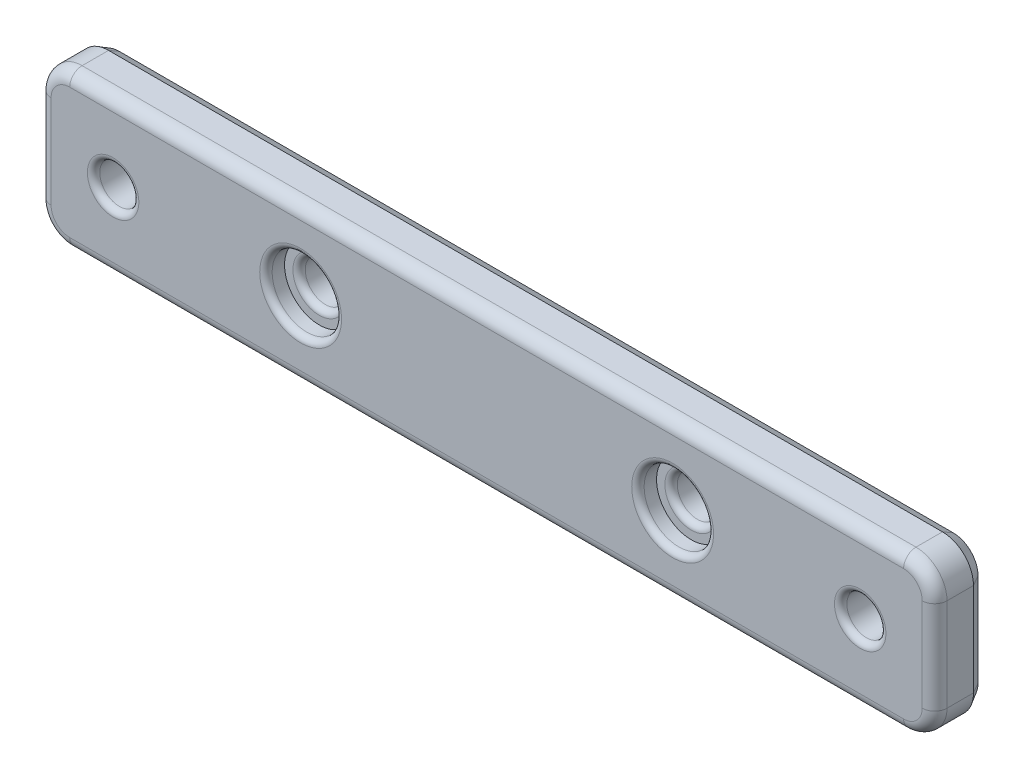
ISO-10303-21;
HEADER;
FILE_DESCRIPTION(('STEP AP214'),'2;1');
FILE_NAME('part.step','',(''),(''),'','','');
FILE_SCHEMA(('AUTOMOTIVE_DESIGN { 1 0 10303 214 1 1 1 1 }'));
ENDSEC;
DATA;
#1=APPLICATION_CONTEXT('core data for automotive mechanical design processes');
#2=APPLICATION_PROTOCOL_DEFINITION('international standard','automotive_design',2000,#1);
#3=PRODUCT_CONTEXT('',#1,'mechanical');
#4=PRODUCT('Part','Part','',(#3));
#5=PRODUCT_RELATED_PRODUCT_CATEGORY('part','',(#4));
#6=PRODUCT_DEFINITION_FORMATION('','',#4);
#7=PRODUCT_DEFINITION_CONTEXT('part definition',#1,'design');
#8=PRODUCT_DEFINITION('design','',#6,#7);
#9=PRODUCT_DEFINITION_SHAPE('','',#8);
#10=(LENGTH_UNIT() NAMED_UNIT(*) SI_UNIT(.MILLI.,.METRE.));
#11=(NAMED_UNIT(*) PLANE_ANGLE_UNIT() SI_UNIT($,.RADIAN.));
#12=(NAMED_UNIT(*) SI_UNIT($,.STERADIAN.) SOLID_ANGLE_UNIT());
#13=UNCERTAINTY_MEASURE_WITH_UNIT(LENGTH_MEASURE(1.E-05),#10,'distance_accuracy_value','');
#14=(GEOMETRIC_REPRESENTATION_CONTEXT(3) GLOBAL_UNCERTAINTY_ASSIGNED_CONTEXT((#13)) GLOBAL_UNIT_ASSIGNED_CONTEXT((#10,
#11,#12)) REPRESENTATION_CONTEXT('',''));
#15=CARTESIAN_POINT('',(0.,0.,0.));
#16=DIRECTION('',(0.,0.,1.));
#17=DIRECTION('',(1.,0.,0.));
#18=AXIS2_PLACEMENT_3D('',#15,#16,#17);
#19=CARTESIAN_POINT('',(-30.,0.,0.));
#20=DIRECTION('',(0.,0.,1.));
#21=DIRECTION('',(1.,0.,0.));
#22=AXIS2_PLACEMENT_3D('',#19,#20,#21);
#23=CYLINDRICAL_SURFACE('',#22,3.25000000000001);
#24=CARTESIAN_POINT('',(-30.,0.,1.00000000000003));
#25=DIRECTION('',(0.,0.,-1.));
#26=DIRECTION('',(-1.,0.,0.));
#27=AXIS2_PLACEMENT_3D('',#24,#25,#26);
#28=CIRCLE('',#27,3.25000000000001);
#29=CARTESIAN_POINT('',(-33.25,0.,1.00000000000003));
#30=VERTEX_POINT('',#29);
#31=EDGE_CURVE('E53',#30,#30,#28,.T.);
#32=ORIENTED_EDGE('',*,*,#31,.T.);
#33=EDGE_LOOP('',(#32));
#34=FACE_BOUND('',#33,.T.);
#35=CARTESIAN_POINT('',(-30.,0.,4.));
#36=DIRECTION('',(0.,0.,1.));
#37=DIRECTION('',(1.,0.,0.));
#38=AXIS2_PLACEMENT_3D('',#35,#36,#37);
#39=CIRCLE('',#38,3.25000000000001);
#40=CARTESIAN_POINT('',(-26.75,0.,4.));
#41=VERTEX_POINT('',#40);
#42=EDGE_CURVE('E260',#41,#41,#39,.T.);
#43=ORIENTED_EDGE('',*,*,#42,.T.);
#44=EDGE_LOOP('',(#43));
#45=FACE_BOUND('',#44,.T.);
#46=ADVANCED_FACE('F43',(#34,#45),#23,.F.);
#47=CARTESIAN_POINT('',(30.,0.,0.));
#48=DIRECTION('',(0.,0.,1.));
#49=DIRECTION('',(1.,0.,0.));
#50=AXIS2_PLACEMENT_3D('',#47,#48,#49);
#51=CYLINDRICAL_SURFACE('',#50,3.25);
#52=CARTESIAN_POINT('',(30.,0.,1.00000000000001));
#53=DIRECTION('',(0.,0.,-1.));
#54=DIRECTION('',(-1.,0.,0.));
#55=AXIS2_PLACEMENT_3D('',#52,#53,#54);
#56=CIRCLE('',#55,3.25);
#57=CARTESIAN_POINT('',(26.75,0.,1.00000000000001));
#58=VERTEX_POINT('',#57);
#59=EDGE_CURVE('E393',#58,#58,#56,.T.);
#60=ORIENTED_EDGE('',*,*,#59,.T.);
#61=EDGE_LOOP('',(#60));
#62=FACE_BOUND('',#61,.T.);
#63=CARTESIAN_POINT('',(30.,0.,4.));
#64=DIRECTION('',(0.,0.,1.));
#65=DIRECTION('',(1.,0.,0.));
#66=AXIS2_PLACEMENT_3D('',#63,#64,#65);
#67=CIRCLE('',#66,3.25);
#68=CARTESIAN_POINT('',(33.25,0.,4.));
#69=VERTEX_POINT('',#68);
#70=EDGE_CURVE('E252',#69,#69,#67,.T.);
#71=ORIENTED_EDGE('',*,*,#70,.T.);
#72=EDGE_LOOP('',(#71));
#73=FACE_BOUND('',#72,.T.);
#74=ADVANCED_FACE('F545',(#62,#73),#51,.F.);
#75=CARTESIAN_POINT('',(72.25,-12.5,8.));
#76=DIRECTION('',(-1.,0.,0.));
#77=DIRECTION('',(0.,0.,1.));
#78=AXIS2_PLACEMENT_3D('',#75,#76,#77);
#79=PLANE('',#78);
#80=DIRECTION('',(0.,0.,-1.));
#81=VECTOR('',#80,1.);
#82=CARTESIAN_POINT('',(72.25,-7.5,8.));
#83=LINE('',#82,#81);
#84=CARTESIAN_POINT('',(72.25,-7.5,6.));
#85=VERTEX_POINT('',#84);
#86=CARTESIAN_POINT('',(72.25,-7.5,1.73205080756889));
#87=VERTEX_POINT('',#86);
#88=EDGE_CURVE('E184',#85,#87,#83,.T.);
#89=ORIENTED_EDGE('',*,*,#88,.T.);
#90=DIRECTION('',(0.,1.,0.));
#91=VECTOR('',#90,1.);
#92=CARTESIAN_POINT('',(72.25,7.5,1.73205080756889));
#93=LINE('',#92,#91);
#94=CARTESIAN_POINT('',(72.25,7.5,1.73205080756889));
#95=VERTEX_POINT('',#94);
#96=EDGE_CURVE('E334',#87,#95,#93,.T.);
#97=ORIENTED_EDGE('',*,*,#96,.T.);
#98=DIRECTION('',(0.,0.,-1.));
#99=VECTOR('',#98,1.);
#100=CARTESIAN_POINT('',(72.25,7.5,8.));
#101=LINE('',#100,#99);
#102=CARTESIAN_POINT('',(72.25,7.5,6.));
#103=VERTEX_POINT('',#102);
#104=EDGE_CURVE('E442',#95,#103,#101,.F.);
#105=ORIENTED_EDGE('',*,*,#104,.T.);
#106=DIRECTION('',(0.,1.,0.));
#107=VECTOR('',#106,1.);
#108=CARTESIAN_POINT('',(72.25,-12.5,6.));
#109=LINE('',#108,#107);
#110=EDGE_CURVE('E194',#103,#85,#109,.F.);
#111=ORIENTED_EDGE('',*,*,#110,.T.);
#112=EDGE_LOOP('',(#89,#97,#105,#111));
#113=FACE_BOUND('',#112,.T.);
#114=ADVANCED_FACE('F550',(#113),#79,.F.);
#115=CARTESIAN_POINT('',(-72.25,12.5,8.));
#116=DIRECTION('',(0.,-1.,0.));
#117=DIRECTION('',(0.,0.,-1.));
#118=AXIS2_PLACEMENT_3D('',#115,#116,#117);
#119=PLANE('',#118);
#120=DIRECTION('',(0.,0.,-1.));
#121=VECTOR('',#120,1.);
#122=CARTESIAN_POINT('',(67.25,12.5,8.));
#123=LINE('',#122,#121);
#124=CARTESIAN_POINT('',(67.25,12.5,6.));
#125=VERTEX_POINT('',#124);
#126=CARTESIAN_POINT('',(67.25,12.5,1.73205080756889));
#127=VERTEX_POINT('',#126);
#128=EDGE_CURVE('E438',#125,#127,#123,.T.);
#129=ORIENTED_EDGE('',*,*,#128,.T.);
#130=DIRECTION('',(-1.,0.,0.));
#131=VECTOR('',#130,1.);
#132=CARTESIAN_POINT('',(-67.25,12.5,1.73205080756889));
#133=LINE('',#132,#131);
#134=CARTESIAN_POINT('',(-67.25,12.5,1.73205080756889));
#135=VERTEX_POINT('',#134);
#136=EDGE_CURVE('E296',#127,#135,#133,.T.);
#137=ORIENTED_EDGE('',*,*,#136,.T.);
#138=DIRECTION('',(0.,0.,-1.));
#139=VECTOR('',#138,1.);
#140=CARTESIAN_POINT('',(-67.25,12.5,8.));
#141=LINE('',#140,#139);
#142=CARTESIAN_POINT('',(-67.25,12.5,6.));
#143=VERTEX_POINT('',#142);
#144=EDGE_CURVE('E436',#135,#143,#141,.F.);
#145=ORIENTED_EDGE('',*,*,#144,.T.);
#146=DIRECTION('',(-1.,0.,0.));
#147=VECTOR('',#146,1.);
#148=CARTESIAN_POINT('',(-72.25,12.5,6.));
#149=LINE('',#148,#147);
#150=EDGE_CURVE('E220',#143,#125,#149,.F.);
#151=ORIENTED_EDGE('',*,*,#150,.T.);
#152=EDGE_LOOP('',(#129,#137,#145,#151));
#153=FACE_BOUND('',#152,.T.);
#154=ADVANCED_FACE('F435',(#153),#119,.F.);
#155=CARTESIAN_POINT('',(-72.25,-12.5,8.));
#156=DIRECTION('',(1.,0.,0.));
#157=DIRECTION('',(0.,0.,-1.));
#158=AXIS2_PLACEMENT_3D('',#155,#156,#157);
#159=PLANE('',#158);
#160=DIRECTION('',(0.,0.,-1.));
#161=VECTOR('',#160,1.);
#162=CARTESIAN_POINT('',(-72.25,7.5,8.));
#163=LINE('',#162,#161);
#164=CARTESIAN_POINT('',(-72.25,7.5,6.));
#165=VERTEX_POINT('',#164);
#166=CARTESIAN_POINT('',(-72.25,7.5,1.73205080756889));
#167=VERTEX_POINT('',#166);
#168=EDGE_CURVE('E507',#165,#167,#163,.T.);
#169=ORIENTED_EDGE('',*,*,#168,.T.);
#170=DIRECTION('',(0.,-1.,0.));
#171=VECTOR('',#170,1.);
#172=CARTESIAN_POINT('',(-72.25,-7.5,1.73205080756889));
#173=LINE('',#172,#171);
#174=CARTESIAN_POINT('',(-72.25,-7.5,1.73205080756889));
#175=VERTEX_POINT('',#174);
#176=EDGE_CURVE('E331',#167,#175,#173,.T.);
#177=ORIENTED_EDGE('',*,*,#176,.T.);
#178=DIRECTION('',(0.,0.,-1.));
#179=VECTOR('',#178,1.);
#180=CARTESIAN_POINT('',(-72.25,-7.5,8.));
#181=LINE('',#180,#179);
#182=CARTESIAN_POINT('',(-72.25,-7.5,6.));
#183=VERTEX_POINT('',#182);
#184=EDGE_CURVE('E447',#175,#183,#181,.F.);
#185=ORIENTED_EDGE('',*,*,#184,.T.);
#186=DIRECTION('',(0.,-1.,0.));
#187=VECTOR('',#186,1.);
#188=CARTESIAN_POINT('',(-72.25,-12.5,6.));
#189=LINE('',#188,#187);
#190=EDGE_CURVE('E213',#183,#165,#189,.F.);
#191=ORIENTED_EDGE('',*,*,#190,.T.);
#192=EDGE_LOOP('',(#169,#177,#185,#191));
#193=FACE_BOUND('',#192,.T.);
#194=ADVANCED_FACE('F506',(#193),#159,.F.);
#195=CARTESIAN_POINT('',(-72.25,-12.5,8.));
#196=DIRECTION('',(0.,1.,0.));
#197=DIRECTION('',(0.,0.,1.));
#198=AXIS2_PLACEMENT_3D('',#195,#196,#197);
#199=PLANE('',#198);
#200=DIRECTION('',(0.,0.,-1.));
#201=VECTOR('',#200,1.);
#202=CARTESIAN_POINT('',(-67.25,-12.5,8.));
#203=LINE('',#202,#201);
#204=CARTESIAN_POINT('',(-67.25,-12.5,6.));
#205=VERTEX_POINT('',#204);
#206=CARTESIAN_POINT('',(-67.25,-12.5,1.73205080756889));
#207=VERTEX_POINT('',#206);
#208=EDGE_CURVE('E513',#205,#207,#203,.T.);
#209=ORIENTED_EDGE('',*,*,#208,.T.);
#210=DIRECTION('',(1.,0.,0.));
#211=VECTOR('',#210,1.);
#212=CARTESIAN_POINT('',(67.25,-12.5,1.73205080756889));
#213=LINE('',#212,#211);
#214=CARTESIAN_POINT('',(67.25,-12.5,1.73205080756889));
#215=VERTEX_POINT('',#214);
#216=EDGE_CURVE('E60',#207,#215,#213,.T.);
#217=ORIENTED_EDGE('',*,*,#216,.T.);
#218=DIRECTION('',(0.,0.,-1.));
#219=VECTOR('',#218,1.);
#220=CARTESIAN_POINT('',(67.25,-12.5,8.));
#221=LINE('',#220,#219);
#222=CARTESIAN_POINT('',(67.25,-12.5,6.));
#223=VERTEX_POINT('',#222);
#224=EDGE_CURVE('E518',#215,#223,#221,.F.);
#225=ORIENTED_EDGE('',*,*,#224,.T.);
#226=DIRECTION('',(1.,0.,0.));
#227=VECTOR('',#226,1.);
#228=CARTESIAN_POINT('',(-72.25,-12.5,6.));
#229=LINE('',#228,#227);
#230=EDGE_CURVE('E206',#223,#205,#229,.F.);
#231=ORIENTED_EDGE('',*,*,#230,.T.);
#232=EDGE_LOOP('',(#209,#217,#225,#231));
#233=FACE_BOUND('',#232,.T.);
#234=ADVANCED_FACE('F556',(#233),#199,.F.);
#235=CARTESIAN_POINT('',(0.,0.,8.));
#236=DIRECTION('',(0.,0.,-1.));
#237=DIRECTION('',(-1.,0.,0.));
#238=AXIS2_PLACEMENT_3D('',#235,#236,#237);
#239=PLANE('',#238);
#240=CARTESIAN_POINT('',(60.25,0.,8.));
#241=DIRECTION('',(0.,0.,-1.));
#242=DIRECTION('',(-1.,0.,0.));
#243=AXIS2_PLACEMENT_3D('',#240,#241,#242);
#244=CIRCLE('',#243,4.15);
#245=CARTESIAN_POINT('',(56.1,0.,8.));
#246=VERTEX_POINT('',#245);
#247=EDGE_CURVE('E280',#246,#246,#244,.T.);
#248=ORIENTED_EDGE('',*,*,#247,.T.);
#249=EDGE_LOOP('',(#248));
#250=FACE_BOUND('',#249,.T.);
#251=CARTESIAN_POINT('',(-60.25,0.,8.));
#252=DIRECTION('',(0.,0.,-1.));
#253=DIRECTION('',(-1.,0.,0.));
#254=AXIS2_PLACEMENT_3D('',#251,#252,#253);
#255=CIRCLE('',#254,4.15);
#256=CARTESIAN_POINT('',(-64.4,0.,8.));
#257=VERTEX_POINT('',#256);
#258=EDGE_CURVE('E276',#257,#257,#255,.T.);
#259=ORIENTED_EDGE('',*,*,#258,.T.);
#260=EDGE_LOOP('',(#259));
#261=FACE_BOUND('',#260,.T.);
#262=CARTESIAN_POINT('',(30.,0.,8.));
#263=DIRECTION('',(0.,0.,-1.));
#264=DIRECTION('',(-1.,0.,0.));
#265=AXIS2_PLACEMENT_3D('',#262,#263,#264);
#266=CIRCLE('',#265,6.6);
#267=CARTESIAN_POINT('',(23.4,0.,8.));
#268=VERTEX_POINT('',#267);
#269=EDGE_CURVE('E272',#268,#268,#266,.T.);
#270=ORIENTED_EDGE('',*,*,#269,.T.);
#271=EDGE_LOOP('',(#270));
#272=FACE_BOUND('',#271,.T.);
#273=CARTESIAN_POINT('',(-30.,0.,8.));
#274=DIRECTION('',(0.,0.,-1.));
#275=DIRECTION('',(-1.,0.,0.));
#276=AXIS2_PLACEMENT_3D('',#273,#274,#275);
#277=CIRCLE('',#276,6.6);
#278=CARTESIAN_POINT('',(-36.6,0.,8.));
#279=VERTEX_POINT('',#278);
#280=EDGE_CURVE('E268',#279,#279,#277,.T.);
#281=ORIENTED_EDGE('',*,*,#280,.T.);
#282=EDGE_LOOP('',(#281));
#283=FACE_BOUND('',#282,.T.);
#284=DIRECTION('',(0.,1.,0.));
#285=VECTOR('',#284,1.);
#286=CARTESIAN_POINT('',(70.25,0.,8.));
#287=LINE('',#286,#285);
#288=CARTESIAN_POINT('',(70.25,-7.5,8.));
#289=VERTEX_POINT('',#288);
#290=CARTESIAN_POINT('',(70.25,7.5,8.));
#291=VERTEX_POINT('',#290);
#292=EDGE_CURVE('E188',#289,#291,#287,.T.);
#293=ORIENTED_EDGE('',*,*,#292,.T.);
#294=CARTESIAN_POINT('',(67.25,7.5,8.));
#295=DIRECTION('',(0.,0.,-1.));
#296=DIRECTION('',(-1.,0.,0.));
#297=AXIS2_PLACEMENT_3D('',#294,#295,#296);
#298=CIRCLE('',#297,3.);
#299=CARTESIAN_POINT('',(67.25,10.5,8.));
#300=VERTEX_POINT('',#299);
#301=EDGE_CURVE('E166',#291,#300,#298,.F.);
#302=ORIENTED_EDGE('',*,*,#301,.T.);
#303=DIRECTION('',(-1.,0.,0.));
#304=VECTOR('',#303,1.);
#305=CARTESIAN_POINT('',(0.,10.5,8.));
#306=LINE('',#305,#304);
#307=CARTESIAN_POINT('',(-67.25,10.5,8.));
#308=VERTEX_POINT('',#307);
#309=EDGE_CURVE('E176',#300,#308,#306,.T.);
#310=ORIENTED_EDGE('',*,*,#309,.T.);
#311=CARTESIAN_POINT('',(-67.25,7.5,8.));
#312=DIRECTION('',(0.,0.,-1.));
#313=DIRECTION('',(-1.,0.,0.));
#314=AXIS2_PLACEMENT_3D('',#311,#312,#313);
#315=CIRCLE('',#314,3.);
#316=CARTESIAN_POINT('',(-70.25,7.5,8.));
#317=VERTEX_POINT('',#316);
#318=EDGE_CURVE('E183',#308,#317,#315,.F.);
#319=ORIENTED_EDGE('',*,*,#318,.T.);
#320=DIRECTION('',(0.,-1.,0.));
#321=VECTOR('',#320,1.);
#322=CARTESIAN_POINT('',(-70.25,0.,8.));
#323=LINE('',#322,#321);
#324=CARTESIAN_POINT('',(-70.25,-7.5,8.));
#325=VERTEX_POINT('',#324);
#326=EDGE_CURVE('E456',#317,#325,#323,.T.);
#327=ORIENTED_EDGE('',*,*,#326,.T.);
#328=CARTESIAN_POINT('',(-67.25,-7.5,8.));
#329=DIRECTION('',(0.,0.,-1.));
#330=DIRECTION('',(-1.,0.,0.));
#331=AXIS2_PLACEMENT_3D('',#328,#329,#330);
#332=CIRCLE('',#331,3.);
#333=CARTESIAN_POINT('',(-67.25,-10.5,8.));
#334=VERTEX_POINT('',#333);
#335=EDGE_CURVE('E459',#325,#334,#332,.F.);
#336=ORIENTED_EDGE('',*,*,#335,.T.);
#337=DIRECTION('',(1.,0.,0.));
#338=VECTOR('',#337,1.);
#339=CARTESIAN_POINT('',(0.,-10.5,8.));
#340=LINE('',#339,#338);
#341=CARTESIAN_POINT('',(67.25,-10.5,8.));
#342=VERTEX_POINT('',#341);
#343=EDGE_CURVE('E462',#334,#342,#340,.T.);
#344=ORIENTED_EDGE('',*,*,#343,.T.);
#345=CARTESIAN_POINT('',(67.25,-7.5,8.));
#346=DIRECTION('',(0.,0.,-1.));
#347=DIRECTION('',(-1.,0.,0.));
#348=AXIS2_PLACEMENT_3D('',#345,#346,#347);
#349=CIRCLE('',#348,3.);
#350=EDGE_CURVE('E196',#342,#289,#349,.F.);
#351=ORIENTED_EDGE('',*,*,#350,.T.);
#352=EDGE_LOOP('',(#293,#302,#310,#319,#327,#336,#344,#351));
#353=FACE_BOUND('',#352,.T.);
#354=ADVANCED_FACE('F186',(#250,#261,#272,#283,#353),#239,.F.);
#355=CARTESIAN_POINT('',(0.,0.,0.));
#356=DIRECTION('',(0.,0.,-1.));
#357=DIRECTION('',(-1.,0.,0.));
#358=AXIS2_PLACEMENT_3D('',#355,#356,#357);
#359=PLANE('',#358);
#360=CARTESIAN_POINT('',(60.25,0.,0.));
#361=DIRECTION('',(0.,0.,-1.));
#362=DIRECTION('',(-1.,0.,0.));
#363=AXIS2_PLACEMENT_3D('',#360,#361,#362);
#364=CIRCLE('',#363,3.72735026918961);
#365=CARTESIAN_POINT('',(56.5226497308104,0.,0.));
#366=VERTEX_POINT('',#365);
#367=EDGE_CURVE('E385',#366,#366,#364,.F.);
#368=ORIENTED_EDGE('',*,*,#367,.T.);
#369=EDGE_LOOP('',(#368));
#370=FACE_BOUND('',#369,.T.);
#371=CARTESIAN_POINT('',(30.,0.,0.));
#372=DIRECTION('',(0.,0.,-1.));
#373=DIRECTION('',(-1.,0.,0.));
#374=AXIS2_PLACEMENT_3D('',#371,#372,#373);
#375=CIRCLE('',#374,3.82735026918964);
#376=CARTESIAN_POINT('',(26.1726497308104,0.,0.));
#377=VERTEX_POINT('',#376);
#378=EDGE_CURVE('E381',#377,#377,#375,.F.);
#379=ORIENTED_EDGE('',*,*,#378,.T.);
#380=EDGE_LOOP('',(#379));
#381=FACE_BOUND('',#380,.T.);
#382=CARTESIAN_POINT('',(-30.,0.,0.));
#383=DIRECTION('',(0.,0.,-1.));
#384=DIRECTION('',(-1.,0.,0.));
#385=AXIS2_PLACEMENT_3D('',#382,#383,#384);
#386=CIRCLE('',#385,3.82735026918965);
#387=CARTESIAN_POINT('',(-33.8273502691896,0.,0.));
#388=VERTEX_POINT('',#387);
#389=EDGE_CURVE('E377',#388,#388,#386,.F.);
#390=ORIENTED_EDGE('',*,*,#389,.T.);
#391=EDGE_LOOP('',(#390));
#392=FACE_BOUND('',#391,.T.);
#393=CARTESIAN_POINT('',(-60.25,0.,0.));
#394=DIRECTION('',(0.,0.,-1.));
#395=DIRECTION('',(-1.,0.,0.));
#396=AXIS2_PLACEMENT_3D('',#393,#394,#395);
#397=CIRCLE('',#396,3.72735026918961);
#398=CARTESIAN_POINT('',(-63.9773502691896,0.,0.));
#399=VERTEX_POINT('',#398);
#400=EDGE_CURVE('E344',#399,#399,#397,.F.);
#401=ORIENTED_EDGE('',*,*,#400,.T.);
#402=EDGE_LOOP('',(#401));
#403=FACE_BOUND('',#402,.T.);
#404=CARTESIAN_POINT('',(-67.25,7.5,0.));
#405=DIRECTION('',(0.,0.,-1.));
#406=DIRECTION('',(-1.,0.,0.));
#407=AXIS2_PLACEMENT_3D('',#404,#405,#406);
#408=CIRCLE('',#407,3.99999999999999);
#409=CARTESIAN_POINT('',(-71.25,7.5,0.));
#410=VERTEX_POINT('',#409);
#411=CARTESIAN_POINT('',(-67.25,11.5,0.));
#412=VERTEX_POINT('',#411);
#413=EDGE_CURVE('E318',#410,#412,#408,.T.);
#414=ORIENTED_EDGE('',*,*,#413,.T.);
#415=DIRECTION('',(1.,0.,0.));
#416=VECTOR('',#415,1.);
#417=CARTESIAN_POINT('',(67.25,11.5,0.));
#418=LINE('',#417,#416);
#419=CARTESIAN_POINT('',(67.25,11.5,0.));
#420=VERTEX_POINT('',#419);
#421=EDGE_CURVE('E321',#412,#420,#418,.T.);
#422=ORIENTED_EDGE('',*,*,#421,.T.);
#423=CARTESIAN_POINT('',(67.25,7.5,0.));
#424=DIRECTION('',(0.,0.,-1.));
#425=DIRECTION('',(-1.,0.,0.));
#426=AXIS2_PLACEMENT_3D('',#423,#424,#425);
#427=CIRCLE('',#426,3.99999999999999);
#428=CARTESIAN_POINT('',(71.25,7.5,0.));
#429=VERTEX_POINT('',#428);
#430=EDGE_CURVE('E315',#420,#429,#427,.T.);
#431=ORIENTED_EDGE('',*,*,#430,.T.);
#432=DIRECTION('',(0.,-1.,0.));
#433=VECTOR('',#432,1.);
#434=CARTESIAN_POINT('',(71.25,-7.5,0.));
#435=LINE('',#434,#433);
#436=CARTESIAN_POINT('',(71.25,-7.5,0.));
#437=VERTEX_POINT('',#436);
#438=EDGE_CURVE('E309',#429,#437,#435,.T.);
#439=ORIENTED_EDGE('',*,*,#438,.T.);
#440=CARTESIAN_POINT('',(67.25,-7.5,0.));
#441=DIRECTION('',(0.,0.,-1.));
#442=DIRECTION('',(-1.,0.,0.));
#443=AXIS2_PLACEMENT_3D('',#440,#441,#442);
#444=CIRCLE('',#443,3.99999999999999);
#445=CARTESIAN_POINT('',(67.25,-11.5,0.));
#446=VERTEX_POINT('',#445);
#447=EDGE_CURVE('E303',#437,#446,#444,.T.);
#448=ORIENTED_EDGE('',*,*,#447,.T.);
#449=DIRECTION('',(-1.,0.,0.));
#450=VECTOR('',#449,1.);
#451=CARTESIAN_POINT('',(-67.25,-11.5,0.));
#452=LINE('',#451,#450);
#453=CARTESIAN_POINT('',(-67.25,-11.5,0.));
#454=VERTEX_POINT('',#453);
#455=EDGE_CURVE('E300',#446,#454,#452,.T.);
#456=ORIENTED_EDGE('',*,*,#455,.T.);
#457=CARTESIAN_POINT('',(-67.25,-7.5,0.));
#458=DIRECTION('',(0.,0.,-1.));
#459=DIRECTION('',(-1.,0.,0.));
#460=AXIS2_PLACEMENT_3D('',#457,#458,#459);
#461=CIRCLE('',#460,3.99999999999999);
#462=CARTESIAN_POINT('',(-71.25,-7.5,0.));
#463=VERTEX_POINT('',#462);
#464=EDGE_CURVE('E306',#454,#463,#461,.T.);
#465=ORIENTED_EDGE('',*,*,#464,.T.);
#466=DIRECTION('',(0.,1.,0.));
#467=VECTOR('',#466,1.);
#468=CARTESIAN_POINT('',(-71.25,7.5,0.));
#469=LINE('',#468,#467);
#470=EDGE_CURVE('E312',#463,#410,#469,.T.);
#471=ORIENTED_EDGE('',*,*,#470,.T.);
#472=EDGE_LOOP('',(#414,#422,#431,#439,#448,#456,#465,#471));
#473=FACE_BOUND('',#472,.T.);
#474=ADVANCED_FACE('F408',(#370,#381,#392,#403,#473),#359,.T.);
#475=CARTESIAN_POINT('',(60.25,0.,0.));
#476=DIRECTION('',(0.,0.,1.));
#477=DIRECTION('',(1.,0.,0.));
#478=AXIS2_PLACEMENT_3D('',#475,#476,#477);
#479=CYLINDRICAL_SURFACE('',#478,3.15);
#480=CARTESIAN_POINT('',(60.25,0.,0.999999999999975));
#481=DIRECTION('',(0.,0.,-1.));
#482=DIRECTION('',(-1.,0.,0.));
#483=AXIS2_PLACEMENT_3D('',#480,#481,#482);
#484=CIRCLE('',#483,3.15);
#485=CARTESIAN_POINT('',(57.1,0.,0.999999999999975));
#486=VERTEX_POINT('',#485);
#487=EDGE_CURVE('E389',#486,#486,#484,.T.);
#488=ORIENTED_EDGE('',*,*,#487,.T.);
#489=EDGE_LOOP('',(#488));
#490=FACE_BOUND('',#489,.T.);
#491=CARTESIAN_POINT('',(60.25,0.,7.));
#492=DIRECTION('',(0.,0.,-1.));
#493=DIRECTION('',(-1.,0.,0.));
#494=AXIS2_PLACEMENT_3D('',#491,#492,#493);
#495=CIRCLE('',#494,3.15);
#496=CARTESIAN_POINT('',(57.1,0.,7.));
#497=VERTEX_POINT('',#496);
#498=EDGE_CURVE('E264',#497,#497,#495,.F.);
#499=ORIENTED_EDGE('',*,*,#498,.T.);
#500=EDGE_LOOP('',(#499));
#501=FACE_BOUND('',#500,.T.);
#502=ADVANCED_FACE('F411',(#490,#501),#479,.F.);
#503=CARTESIAN_POINT('',(-60.25,0.,0.));
#504=DIRECTION('',(0.,0.,1.));
#505=DIRECTION('',(1.,0.,0.));
#506=AXIS2_PLACEMENT_3D('',#503,#504,#505);
#507=CYLINDRICAL_SURFACE('',#506,3.15);
#508=CARTESIAN_POINT('',(-60.25,0.,0.999999999999951));
#509=DIRECTION('',(0.,0.,-1.));
#510=DIRECTION('',(-1.,0.,0.));
#511=AXIS2_PLACEMENT_3D('',#508,#509,#510);
#512=CIRCLE('',#511,3.15);
#513=CARTESIAN_POINT('',(-63.4,0.,0.999999999999951));
#514=VERTEX_POINT('',#513);
#515=EDGE_CURVE('E11',#514,#514,#512,.T.);
#516=ORIENTED_EDGE('',*,*,#515,.T.);
#517=EDGE_LOOP('',(#516));
#518=FACE_BOUND('',#517,.T.);
#519=CARTESIAN_POINT('',(-60.25,0.,7.));
#520=DIRECTION('',(0.,0.,-1.));
#521=DIRECTION('',(-1.,0.,0.));
#522=AXIS2_PLACEMENT_3D('',#519,#520,#521);
#523=CIRCLE('',#522,3.15);
#524=CARTESIAN_POINT('',(-63.4,0.,7.));
#525=VERTEX_POINT('',#524);
#526=EDGE_CURVE('E284',#525,#525,#523,.F.);
#527=ORIENTED_EDGE('',*,*,#526,.T.);
#528=EDGE_LOOP('',(#527));
#529=FACE_BOUND('',#528,.T.);
#530=ADVANCED_FACE('F694',(#518,#529),#507,.F.);
#531=CARTESIAN_POINT('',(30.,0.,5.));
#532=DIRECTION('',(0.,0.,1.));
#533=DIRECTION('',(1.,0.,0.));
#534=AXIS2_PLACEMENT_3D('',#531,#532,#533);
#535=PLANE('',#534);
#536=CARTESIAN_POINT('',(30.,0.,5.));
#537=DIRECTION('',(0.,0.,1.));
#538=DIRECTION('',(1.,0.,0.));
#539=AXIS2_PLACEMENT_3D('',#536,#537,#538);
#540=CIRCLE('',#539,4.25);
#541=CARTESIAN_POINT('',(34.25,0.,5.));
#542=VERTEX_POINT('',#541);
#543=EDGE_CURVE('E222',#542,#542,#540,.F.);
#544=ORIENTED_EDGE('',*,*,#543,.T.);
#545=EDGE_LOOP('',(#544));
#546=FACE_BOUND('',#545,.T.);
#547=CARTESIAN_POINT('',(30.,0.,5.));
#548=DIRECTION('',(0.,0.,1.));
#549=DIRECTION('',(1.,0.,0.));
#550=AXIS2_PLACEMENT_3D('',#547,#548,#549);
#551=CIRCLE('',#550,5.6);
#552=CARTESIAN_POINT('',(35.6,0.,5.));
#553=VERTEX_POINT('',#552);
#554=EDGE_CURVE('E248',#553,#553,#551,.T.);
#555=ORIENTED_EDGE('',*,*,#554,.T.);
#556=EDGE_LOOP('',(#555));
#557=FACE_BOUND('',#556,.T.);
#558=ADVANCED_FACE('F691',(#546,#557),#535,.T.);
#559=CARTESIAN_POINT('',(30.,0.,5.));
#560=DIRECTION('',(0.,0.,1.));
#561=DIRECTION('',(1.,0.,0.));
#562=AXIS2_PLACEMENT_3D('',#559,#560,#561);
#563=CYLINDRICAL_SURFACE('',#562,5.6);
#564=CARTESIAN_POINT('',(30.,0.,7.));
#565=DIRECTION('',(0.,0.,-1.));
#566=DIRECTION('',(-1.,0.,0.));
#567=AXIS2_PLACEMENT_3D('',#564,#565,#566);
#568=CIRCLE('',#567,5.6);
#569=CARTESIAN_POINT('',(24.4,0.,7.));
#570=VERTEX_POINT('',#569);
#571=EDGE_CURVE('E288',#570,#570,#568,.F.);
#572=ORIENTED_EDGE('',*,*,#571,.T.);
#573=EDGE_LOOP('',(#572));
#574=FACE_BOUND('',#573,.T.);
#575=ORIENTED_EDGE('',*,*,#554,.F.);
#576=EDGE_LOOP('',(#575));
#577=FACE_BOUND('',#576,.T.);
#578=ADVANCED_FACE('F540',(#574,#577),#563,.F.);
#579=CARTESIAN_POINT('',(-30.,0.,5.));
#580=DIRECTION('',(0.,0.,1.));
#581=DIRECTION('',(1.,0.,0.));
#582=AXIS2_PLACEMENT_3D('',#579,#580,#581);
#583=PLANE('',#582);
#584=CARTESIAN_POINT('',(-30.,0.,5.));
#585=DIRECTION('',(0.,0.,1.));
#586=DIRECTION('',(1.,0.,0.));
#587=AXIS2_PLACEMENT_3D('',#584,#585,#586);
#588=CIRCLE('',#587,4.25000000000001);
#589=CARTESIAN_POINT('',(-25.75,0.,5.));
#590=VERTEX_POINT('',#589);
#591=EDGE_CURVE('E256',#590,#590,#588,.F.);
#592=ORIENTED_EDGE('',*,*,#591,.T.);
#593=EDGE_LOOP('',(#592));
#594=FACE_BOUND('',#593,.T.);
#595=CARTESIAN_POINT('',(-30.,0.,5.));
#596=DIRECTION('',(0.,0.,1.));
#597=DIRECTION('',(1.,0.,0.));
#598=AXIS2_PLACEMENT_3D('',#595,#596,#597);
#599=CIRCLE('',#598,5.6);
#600=CARTESIAN_POINT('',(-24.4,0.,5.));
#601=VERTEX_POINT('',#600);
#602=EDGE_CURVE('E521',#601,#601,#599,.T.);
#603=ORIENTED_EDGE('',*,*,#602,.T.);
#604=EDGE_LOOP('',(#603));
#605=FACE_BOUND('',#604,.T.);
#606=ADVANCED_FACE('F529',(#594,#605),#583,.T.);
#607=CARTESIAN_POINT('',(-30.,0.,5.));
#608=DIRECTION('',(0.,0.,1.));
#609=DIRECTION('',(1.,0.,0.));
#610=AXIS2_PLACEMENT_3D('',#607,#608,#609);
#611=CYLINDRICAL_SURFACE('',#610,5.6);
#612=CARTESIAN_POINT('',(-30.,0.,7.));
#613=DIRECTION('',(0.,0.,-1.));
#614=DIRECTION('',(-1.,0.,0.));
#615=AXIS2_PLACEMENT_3D('',#612,#613,#614);
#616=CIRCLE('',#615,5.6);
#617=CARTESIAN_POINT('',(-35.6,0.,7.));
#618=VERTEX_POINT('',#617);
#619=EDGE_CURVE('E292',#618,#618,#616,.F.);
#620=ORIENTED_EDGE('',*,*,#619,.T.);
#621=EDGE_LOOP('',(#620));
#622=FACE_BOUND('',#621,.T.);
#623=ORIENTED_EDGE('',*,*,#602,.F.);
#624=EDGE_LOOP('',(#623));
#625=FACE_BOUND('',#624,.T.);
#626=ADVANCED_FACE('F531',(#622,#625),#611,.F.);
#627=CARTESIAN_POINT('',(-67.25,-7.5,8.));
#628=DIRECTION('',(0.,0.,-1.));
#629=DIRECTION('',(-1.,0.,0.));
#630=AXIS2_PLACEMENT_3D('',#627,#628,#629);
#631=CYLINDRICAL_SURFACE('',#630,5.);
#632=ORIENTED_EDGE('',*,*,#184,.F.);
#633=CARTESIAN_POINT('',(-67.25,-7.5,1.73205080756889));
#634=DIRECTION('',(0.,0.,-1.));
#635=DIRECTION('',(-1.,0.,0.));
#636=AXIS2_PLACEMENT_3D('',#633,#634,#635);
#637=CIRCLE('',#636,5.);
#638=EDGE_CURVE('E68',#175,#207,#637,.F.);
#639=ORIENTED_EDGE('',*,*,#638,.T.);
#640=ORIENTED_EDGE('',*,*,#208,.F.);
#641=CARTESIAN_POINT('',(-67.25,-7.5,6.));
#642=DIRECTION('',(0.,0.,-1.));
#643=DIRECTION('',(-1.,0.,0.));
#644=AXIS2_PLACEMENT_3D('',#641,#642,#643);
#645=CIRCLE('',#644,5.);
#646=EDGE_CURVE('E209',#205,#183,#645,.T.);
#647=ORIENTED_EDGE('',*,*,#646,.T.);
#648=EDGE_LOOP('',(#632,#639,#640,#647));
#649=FACE_BOUND('',#648,.T.);
#650=ADVANCED_FACE('F508',(#649),#631,.T.);
#651=CARTESIAN_POINT('',(-67.25,7.5,8.));
#652=DIRECTION('',(0.,0.,-1.));
#653=DIRECTION('',(-1.,0.,0.));
#654=AXIS2_PLACEMENT_3D('',#651,#652,#653);
#655=CYLINDRICAL_SURFACE('',#654,5.);
#656=ORIENTED_EDGE('',*,*,#144,.F.);
#657=CARTESIAN_POINT('',(-67.25,7.5,1.73205080756889));
#658=DIRECTION('',(0.,0.,-1.));
#659=DIRECTION('',(-1.,0.,0.));
#660=AXIS2_PLACEMENT_3D('',#657,#658,#659);
#661=CIRCLE('',#660,5.);
#662=EDGE_CURVE('E325',#135,#167,#661,.F.);
#663=ORIENTED_EDGE('',*,*,#662,.T.);
#664=ORIENTED_EDGE('',*,*,#168,.F.);
#665=CARTESIAN_POINT('',(-67.25,7.5,6.));
#666=DIRECTION('',(0.,0.,-1.));
#667=DIRECTION('',(-1.,0.,0.));
#668=AXIS2_PLACEMENT_3D('',#665,#666,#667);
#669=CIRCLE('',#668,5.);
#670=EDGE_CURVE('E216',#165,#143,#669,.T.);
#671=ORIENTED_EDGE('',*,*,#670,.T.);
#672=EDGE_LOOP('',(#656,#663,#664,#671));
#673=FACE_BOUND('',#672,.T.);
#674=ADVANCED_FACE('F439',(#673),#655,.T.);
#675=CARTESIAN_POINT('',(67.25,-7.5,8.));
#676=DIRECTION('',(0.,0.,-1.));
#677=DIRECTION('',(-1.,0.,0.));
#678=AXIS2_PLACEMENT_3D('',#675,#676,#677);
#679=CYLINDRICAL_SURFACE('',#678,5.);
#680=ORIENTED_EDGE('',*,*,#224,.F.);
#681=CARTESIAN_POINT('',(67.25,-7.5,1.73205080756889));
#682=DIRECTION('',(0.,0.,-1.));
#683=DIRECTION('',(-1.,0.,0.));
#684=AXIS2_PLACEMENT_3D('',#681,#682,#683);
#685=CIRCLE('',#684,5.);
#686=EDGE_CURVE('E339',#215,#87,#685,.F.);
#687=ORIENTED_EDGE('',*,*,#686,.T.);
#688=ORIENTED_EDGE('',*,*,#88,.F.);
#689=CARTESIAN_POINT('',(67.25,-7.5,6.));
#690=DIRECTION('',(0.,0.,-1.));
#691=DIRECTION('',(-1.,0.,0.));
#692=AXIS2_PLACEMENT_3D('',#689,#690,#691);
#693=CIRCLE('',#692,5.);
#694=EDGE_CURVE('E202',#85,#223,#693,.T.);
#695=ORIENTED_EDGE('',*,*,#694,.T.);
#696=EDGE_LOOP('',(#680,#687,#688,#695));
#697=FACE_BOUND('',#696,.T.);
#698=ADVANCED_FACE('F569',(#697),#679,.T.);
#699=CARTESIAN_POINT('',(67.25,7.5,8.));
#700=DIRECTION('',(0.,0.,-1.));
#701=DIRECTION('',(-1.,0.,0.));
#702=AXIS2_PLACEMENT_3D('',#699,#700,#701);
#703=CYLINDRICAL_SURFACE('',#702,5.);
#704=ORIENTED_EDGE('',*,*,#104,.F.);
#705=CARTESIAN_POINT('',(67.25,7.5,1.73205080756889));
#706=DIRECTION('',(0.,0.,-1.));
#707=DIRECTION('',(-1.,0.,0.));
#708=AXIS2_PLACEMENT_3D('',#705,#706,#707);
#709=CIRCLE('',#708,5.);
#710=EDGE_CURVE('E328',#95,#127,#709,.F.);
#711=ORIENTED_EDGE('',*,*,#710,.T.);
#712=ORIENTED_EDGE('',*,*,#128,.F.);
#713=CARTESIAN_POINT('',(67.25,7.5,6.));
#714=DIRECTION('',(0.,0.,-1.));
#715=DIRECTION('',(-1.,0.,0.));
#716=AXIS2_PLACEMENT_3D('',#713,#714,#715);
#717=CIRCLE('',#716,5.);
#718=EDGE_CURVE('E168',#125,#103,#717,.T.);
#719=ORIENTED_EDGE('',*,*,#718,.T.);
#720=EDGE_LOOP('',(#704,#711,#712,#719));
#721=FACE_BOUND('',#720,.T.);
#722=ADVANCED_FACE('F479',(#721),#703,.T.);
#723=CARTESIAN_POINT('',(-67.25,-7.5,6.));
#724=DIRECTION('',(0.,0.,-1.));
#725=DIRECTION('',(-1.,0.,0.));
#726=AXIS2_PLACEMENT_3D('',#723,#724,#725);
#727=TOROIDAL_SURFACE('',#726,3.,2.);
#728=CARTESIAN_POINT('',(-70.25,-7.5,6.));
#729=DIRECTION('',(0.,1.,0.));
#730=DIRECTION('',(0.,0.,1.));
#731=AXIS2_PLACEMENT_3D('',#728,#729,#730);
#732=CIRCLE('',#731,2.);
#733=EDGE_CURVE('E240',#183,#325,#732,.T.);
#734=ORIENTED_EDGE('',*,*,#733,.F.);
#735=ORIENTED_EDGE('',*,*,#646,.F.);
#736=CARTESIAN_POINT('',(-67.25,-10.5,6.));
#737=DIRECTION('',(1.,0.,0.));
#738=DIRECTION('',(0.,0.,-1.));
#739=AXIS2_PLACEMENT_3D('',#736,#737,#738);
#740=CIRCLE('',#739,2.);
#741=EDGE_CURVE('E244',#334,#205,#740,.T.);
#742=ORIENTED_EDGE('',*,*,#741,.F.);
#743=ORIENTED_EDGE('',*,*,#335,.F.);
#744=EDGE_LOOP('',(#734,#735,#742,#743));
#745=FACE_BOUND('',#744,.T.);
#746=ADVANCED_FACE('F575',(#745),#727,.T.);
#747=CARTESIAN_POINT('',(0.,-10.5,6.));
#748=DIRECTION('',(1.,0.,0.));
#749=DIRECTION('',(0.,0.,-1.));
#750=AXIS2_PLACEMENT_3D('',#747,#748,#749);
#751=CYLINDRICAL_SURFACE('',#750,2.);
#752=ORIENTED_EDGE('',*,*,#741,.T.);
#753=ORIENTED_EDGE('',*,*,#230,.F.);
#754=CARTESIAN_POINT('',(67.25,-10.5,6.));
#755=DIRECTION('',(1.,0.,0.));
#756=DIRECTION('',(0.,0.,-1.));
#757=AXIS2_PLACEMENT_3D('',#754,#755,#756);
#758=CIRCLE('',#757,2.);
#759=EDGE_CURVE('E236',#342,#223,#758,.T.);
#760=ORIENTED_EDGE('',*,*,#759,.F.);
#761=ORIENTED_EDGE('',*,*,#343,.F.);
#762=EDGE_LOOP('',(#752,#753,#760,#761));
#763=FACE_BOUND('',#762,.T.);
#764=ADVANCED_FACE('F592',(#763),#751,.T.);
#765=CARTESIAN_POINT('',(-70.25,0.,6.));
#766=DIRECTION('',(0.,-1.,0.));
#767=DIRECTION('',(0.,0.,-1.));
#768=AXIS2_PLACEMENT_3D('',#765,#766,#767);
#769=CYLINDRICAL_SURFACE('',#768,2.);
#770=ORIENTED_EDGE('',*,*,#733,.T.);
#771=ORIENTED_EDGE('',*,*,#326,.F.);
#772=CARTESIAN_POINT('',(-70.25,7.5,6.));
#773=DIRECTION('',(0.,1.,0.));
#774=DIRECTION('',(0.,0.,1.));
#775=AXIS2_PLACEMENT_3D('',#772,#773,#774);
#776=CIRCLE('',#775,2.);
#777=EDGE_CURVE('E232',#165,#317,#776,.T.);
#778=ORIENTED_EDGE('',*,*,#777,.F.);
#779=ORIENTED_EDGE('',*,*,#190,.F.);
#780=EDGE_LOOP('',(#770,#771,#778,#779));
#781=FACE_BOUND('',#780,.T.);
#782=ADVANCED_FACE('F589',(#781),#769,.T.);
#783=CARTESIAN_POINT('',(67.25,-7.5,6.));
#784=DIRECTION('',(0.,0.,-1.));
#785=DIRECTION('',(-1.,0.,0.));
#786=AXIS2_PLACEMENT_3D('',#783,#784,#785);
#787=TOROIDAL_SURFACE('',#786,3.,2.);
#788=ORIENTED_EDGE('',*,*,#759,.T.);
#789=ORIENTED_EDGE('',*,*,#694,.F.);
#790=CARTESIAN_POINT('',(70.25,-7.5,6.));
#791=DIRECTION('',(0.,1.,0.));
#792=DIRECTION('',(0.,0.,1.));
#793=AXIS2_PLACEMENT_3D('',#790,#791,#792);
#794=CIRCLE('',#793,2.);
#795=EDGE_CURVE('E228',#289,#85,#794,.T.);
#796=ORIENTED_EDGE('',*,*,#795,.F.);
#797=ORIENTED_EDGE('',*,*,#350,.F.);
#798=EDGE_LOOP('',(#788,#789,#796,#797));
#799=FACE_BOUND('',#798,.T.);
#800=ADVANCED_FACE('F471',(#799),#787,.T.);
#801=CARTESIAN_POINT('',(-67.25,7.5,6.));
#802=DIRECTION('',(0.,0.,-1.));
#803=DIRECTION('',(-1.,0.,0.));
#804=AXIS2_PLACEMENT_3D('',#801,#802,#803);
#805=TOROIDAL_SURFACE('',#804,3.,2.);
#806=ORIENTED_EDGE('',*,*,#777,.T.);
#807=ORIENTED_EDGE('',*,*,#318,.F.);
#808=CARTESIAN_POINT('',(-67.25,10.5,6.));
#809=DIRECTION('',(1.,0.,0.));
#810=DIRECTION('',(0.,0.,-1.));
#811=AXIS2_PLACEMENT_3D('',#808,#809,#810);
#812=CIRCLE('',#811,2.);
#813=EDGE_CURVE('E179',#143,#308,#812,.T.);
#814=ORIENTED_EDGE('',*,*,#813,.F.);
#815=ORIENTED_EDGE('',*,*,#670,.F.);
#816=EDGE_LOOP('',(#806,#807,#814,#815));
#817=FACE_BOUND('',#816,.T.);
#818=ADVANCED_FACE('F583',(#817),#805,.T.);
#819=CARTESIAN_POINT('',(70.25,0.,6.));
#820=DIRECTION('',(0.,1.,0.));
#821=DIRECTION('',(0.,0.,1.));
#822=AXIS2_PLACEMENT_3D('',#819,#820,#821);
#823=CYLINDRICAL_SURFACE('',#822,2.);
#824=ORIENTED_EDGE('',*,*,#795,.T.);
#825=ORIENTED_EDGE('',*,*,#110,.F.);
#826=CARTESIAN_POINT('',(70.25,7.5,6.));
#827=DIRECTION('',(0.,1.,0.));
#828=DIRECTION('',(0.,0.,1.));
#829=AXIS2_PLACEMENT_3D('',#826,#827,#828);
#830=CIRCLE('',#829,2.);
#831=EDGE_CURVE('E172',#291,#103,#830,.T.);
#832=ORIENTED_EDGE('',*,*,#831,.F.);
#833=ORIENTED_EDGE('',*,*,#292,.F.);
#834=EDGE_LOOP('',(#824,#825,#832,#833));
#835=FACE_BOUND('',#834,.T.);
#836=ADVANCED_FACE('F474',(#835),#823,.T.);
#837=CARTESIAN_POINT('',(0.,10.5,6.));
#838=DIRECTION('',(-1.,0.,0.));
#839=DIRECTION('',(0.,0.,1.));
#840=AXIS2_PLACEMENT_3D('',#837,#838,#839);
#841=CYLINDRICAL_SURFACE('',#840,2.);
#842=ORIENTED_EDGE('',*,*,#813,.T.);
#843=ORIENTED_EDGE('',*,*,#309,.F.);
#844=CARTESIAN_POINT('',(67.25,10.5,6.));
#845=DIRECTION('',(1.,0.,0.));
#846=DIRECTION('',(0.,0.,-1.));
#847=AXIS2_PLACEMENT_3D('',#844,#845,#846);
#848=CIRCLE('',#847,2.);
#849=EDGE_CURVE('E161',#125,#300,#848,.T.);
#850=ORIENTED_EDGE('',*,*,#849,.F.);
#851=ORIENTED_EDGE('',*,*,#150,.F.);
#852=EDGE_LOOP('',(#842,#843,#850,#851));
#853=FACE_BOUND('',#852,.T.);
#854=ADVANCED_FACE('F177',(#853),#841,.T.);
#855=CARTESIAN_POINT('',(67.25,7.5,6.));
#856=DIRECTION('',(0.,0.,-1.));
#857=DIRECTION('',(-1.,0.,0.));
#858=AXIS2_PLACEMENT_3D('',#855,#856,#857);
#859=TOROIDAL_SURFACE('',#858,3.,2.);
#860=ORIENTED_EDGE('',*,*,#831,.T.);
#861=ORIENTED_EDGE('',*,*,#718,.F.);
#862=ORIENTED_EDGE('',*,*,#849,.T.);
#863=ORIENTED_EDGE('',*,*,#301,.F.);
#864=EDGE_LOOP('',(#860,#861,#862,#863));
#865=FACE_BOUND('',#864,.T.);
#866=ADVANCED_FACE('F164',(#865),#859,.T.);
#867=CARTESIAN_POINT('',(30.,0.,4.));
#868=DIRECTION('',(0.,0.,1.));
#869=DIRECTION('',(1.,0.,0.));
#870=AXIS2_PLACEMENT_3D('',#867,#868,#869);
#871=TOROIDAL_SURFACE('',#870,4.25,1.);
#872=ORIENTED_EDGE('',*,*,#70,.F.);
#873=EDGE_LOOP('',(#872));
#874=FACE_BOUND('',#873,.T.);
#875=ORIENTED_EDGE('',*,*,#543,.F.);
#876=EDGE_LOOP('',(#875));
#877=FACE_BOUND('',#876,.T.);
#878=ADVANCED_FACE('F578',(#874,#877),#871,.T.);
#879=CARTESIAN_POINT('',(-30.,0.,4.));
#880=DIRECTION('',(0.,0.,1.));
#881=DIRECTION('',(1.,0.,0.));
#882=AXIS2_PLACEMENT_3D('',#879,#880,#881);
#883=TOROIDAL_SURFACE('',#882,4.25000000000001,1.);
#884=ORIENTED_EDGE('',*,*,#42,.F.);
#885=EDGE_LOOP('',(#884));
#886=FACE_BOUND('',#885,.T.);
#887=ORIENTED_EDGE('',*,*,#591,.F.);
#888=EDGE_LOOP('',(#887));
#889=FACE_BOUND('',#888,.T.);
#890=ADVANCED_FACE('F602',(#886,#889),#883,.T.);
#891=CARTESIAN_POINT('',(60.25,0.,7.));
#892=DIRECTION('',(0.,0.,-1.));
#893=DIRECTION('',(-1.,0.,0.));
#894=AXIS2_PLACEMENT_3D('',#891,#892,#893);
#895=TOROIDAL_SURFACE('',#894,4.15,1.);
#896=ORIENTED_EDGE('',*,*,#247,.F.);
#897=EDGE_LOOP('',(#896));
#898=FACE_BOUND('',#897,.T.);
#899=ORIENTED_EDGE('',*,*,#498,.F.);
#900=EDGE_LOOP('',(#899));
#901=FACE_BOUND('',#900,.T.);
#902=ADVANCED_FACE('F606',(#898,#901),#895,.T.);
#903=CARTESIAN_POINT('',(-60.25,0.,7.));
#904=DIRECTION('',(0.,0.,-1.));
#905=DIRECTION('',(-1.,0.,0.));
#906=AXIS2_PLACEMENT_3D('',#903,#904,#905);
#907=TOROIDAL_SURFACE('',#906,4.15,1.);
#908=ORIENTED_EDGE('',*,*,#258,.F.);
#909=EDGE_LOOP('',(#908));
#910=FACE_BOUND('',#909,.T.);
#911=ORIENTED_EDGE('',*,*,#526,.F.);
#912=EDGE_LOOP('',(#911));
#913=FACE_BOUND('',#912,.T.);
#914=ADVANCED_FACE('F610',(#910,#913),#907,.T.);
#915=CARTESIAN_POINT('',(30.,0.,7.));
#916=DIRECTION('',(0.,0.,-1.));
#917=DIRECTION('',(-1.,0.,0.));
#918=AXIS2_PLACEMENT_3D('',#915,#916,#917);
#919=TOROIDAL_SURFACE('',#918,6.6,1.);
#920=ORIENTED_EDGE('',*,*,#269,.F.);
#921=EDGE_LOOP('',(#920));
#922=FACE_BOUND('',#921,.T.);
#923=ORIENTED_EDGE('',*,*,#571,.F.);
#924=EDGE_LOOP('',(#923));
#925=FACE_BOUND('',#924,.T.);
#926=ADVANCED_FACE('F614',(#922,#925),#919,.T.);
#927=CARTESIAN_POINT('',(-30.,0.,7.));
#928=DIRECTION('',(0.,0.,-1.));
#929=DIRECTION('',(-1.,0.,0.));
#930=AXIS2_PLACEMENT_3D('',#927,#928,#929);
#931=TOROIDAL_SURFACE('',#930,6.6,1.);
#932=ORIENTED_EDGE('',*,*,#280,.F.);
#933=EDGE_LOOP('',(#932));
#934=FACE_BOUND('',#933,.T.);
#935=ORIENTED_EDGE('',*,*,#619,.F.);
#936=EDGE_LOOP('',(#935));
#937=FACE_BOUND('',#936,.T.);
#938=ADVANCED_FACE('F618',(#934,#937),#931,.T.);
#939=CARTESIAN_POINT('',(-72.25,-12.5,1.73205080756889));
#940=DIRECTION('',(0.,-0.866025403784437,-0.500000000000004));
#941=DIRECTION('',(-1.,0.,0.));
#942=AXIS2_PLACEMENT_3D('',#939,#940,#941);
#943=PLANE('',#942);
#944=DIRECTION('',(0.,-0.500000000000004,0.866025403784437));
#945=VECTOR('',#944,1.);
#946=CARTESIAN_POINT('',(-67.25,-11.5,0.));
#947=LINE('',#946,#945);
#948=EDGE_CURVE('E367',#454,#207,#947,.T.);
#949=ORIENTED_EDGE('',*,*,#948,.F.);
#950=ORIENTED_EDGE('',*,*,#455,.F.);
#951=DIRECTION('',(0.,0.500000000000004,-0.866025403784437));
#952=VECTOR('',#951,1.);
#953=CARTESIAN_POINT('',(67.25,-12.5,1.73205080756889));
#954=LINE('',#953,#952);
#955=EDGE_CURVE('E173',#215,#446,#954,.T.);
#956=ORIENTED_EDGE('',*,*,#955,.F.);
#957=ORIENTED_EDGE('',*,*,#216,.F.);
#958=EDGE_LOOP('',(#949,#950,#956,#957));
#959=FACE_BOUND('',#958,.T.);
#960=ADVANCED_FACE('F497',(#959),#943,.T.);
#961=CARTESIAN_POINT('',(67.25,-7.5,0.));
#962=DIRECTION('',(0.,0.,1.));
#963=DIRECTION('',(1.,0.,0.));
#964=AXIS2_PLACEMENT_3D('',#961,#962,#963);
#965=CONICAL_SURFACE('',#964,3.99999999999999,0.523598775598301);
#966=ORIENTED_EDGE('',*,*,#955,.T.);
#967=ORIENTED_EDGE('',*,*,#447,.F.);
#968=DIRECTION('',(-0.500000000000004,0.,-0.866025403784436));
#969=VECTOR('',#968,1.);
#970=CARTESIAN_POINT('',(72.25,-7.5,1.73205080756889));
#971=LINE('',#970,#969);
#972=EDGE_CURVE('E363',#87,#437,#971,.T.);
#973=ORIENTED_EDGE('',*,*,#972,.F.);
#974=ORIENTED_EDGE('',*,*,#686,.F.);
#975=EDGE_LOOP('',(#966,#967,#973,#974));
#976=FACE_BOUND('',#975,.T.);
#977=ADVANCED_FACE('F492',(#976),#965,.T.);
#978=CARTESIAN_POINT('',(-67.25,-7.5,0.));
#979=DIRECTION('',(0.,0.,1.));
#980=DIRECTION('',(1.,0.,0.));
#981=AXIS2_PLACEMENT_3D('',#978,#979,#980);
#982=CONICAL_SURFACE('',#981,3.99999999999999,0.523598775598303);
#983=ORIENTED_EDGE('',*,*,#948,.T.);
#984=ORIENTED_EDGE('',*,*,#638,.F.);
#985=DIRECTION('',(-0.500000000000004,0.,0.866025403784436));
#986=VECTOR('',#985,1.);
#987=CARTESIAN_POINT('',(-71.25,-7.5,0.));
#988=LINE('',#987,#986);
#989=EDGE_CURVE('E359',#463,#175,#988,.T.);
#990=ORIENTED_EDGE('',*,*,#989,.F.);
#991=ORIENTED_EDGE('',*,*,#464,.F.);
#992=EDGE_LOOP('',(#983,#984,#990,#991));
#993=FACE_BOUND('',#992,.T.);
#994=ADVANCED_FACE('F501',(#993),#982,.T.);
#995=CARTESIAN_POINT('',(72.25,-12.5,1.73205080756889));
#996=DIRECTION('',(0.866025403784437,0.,-0.500000000000004));
#997=DIRECTION('',(0.,-1.,0.));
#998=AXIS2_PLACEMENT_3D('',#995,#996,#997);
#999=PLANE('',#998);
#1000=ORIENTED_EDGE('',*,*,#972,.T.);
#1001=ORIENTED_EDGE('',*,*,#438,.F.);
#1002=DIRECTION('',(-0.500000000000004,0.,-0.866025403784437));
#1003=VECTOR('',#1002,1.);
#1004=CARTESIAN_POINT('',(72.25,7.5,1.73205080756889));
#1005=LINE('',#1004,#1003);
#1006=EDGE_CURVE('E355',#95,#429,#1005,.T.);
#1007=ORIENTED_EDGE('',*,*,#1006,.F.);
#1008=ORIENTED_EDGE('',*,*,#96,.F.);
#1009=EDGE_LOOP('',(#1000,#1001,#1007,#1008));
#1010=FACE_BOUND('',#1009,.T.);
#1011=ADVANCED_FACE('F487',(#1010),#999,.T.);
#1012=CARTESIAN_POINT('',(-72.25,-12.5,1.73205080756889));
#1013=DIRECTION('',(-0.866025403784437,0.,-0.500000000000004));
#1014=DIRECTION('',(0.,1.,0.));
#1015=AXIS2_PLACEMENT_3D('',#1012,#1013,#1014);
#1016=PLANE('',#1015);
#1017=ORIENTED_EDGE('',*,*,#989,.T.);
#1018=ORIENTED_EDGE('',*,*,#176,.F.);
#1019=DIRECTION('',(-0.500000000000004,0.,0.866025403784437));
#1020=VECTOR('',#1019,1.);
#1021=CARTESIAN_POINT('',(-71.25,7.5,0.));
#1022=LINE('',#1021,#1020);
#1023=EDGE_CURVE('E351',#410,#167,#1022,.T.);
#1024=ORIENTED_EDGE('',*,*,#1023,.F.);
#1025=ORIENTED_EDGE('',*,*,#470,.F.);
#1026=EDGE_LOOP('',(#1017,#1018,#1024,#1025));
#1027=FACE_BOUND('',#1026,.T.);
#1028=ADVANCED_FACE('F504',(#1027),#1016,.T.);
#1029=CARTESIAN_POINT('',(67.25,7.5,0.));
#1030=DIRECTION('',(0.,0.,1.));
#1031=DIRECTION('',(1.,0.,0.));
#1032=AXIS2_PLACEMENT_3D('',#1029,#1030,#1031);
#1033=CONICAL_SURFACE('',#1032,3.99999999999999,0.523598775598303);
#1034=ORIENTED_EDGE('',*,*,#1006,.T.);
#1035=ORIENTED_EDGE('',*,*,#430,.F.);
#1036=DIRECTION('',(0.,-0.500000000000002,-0.866025403784438));
#1037=VECTOR('',#1036,1.);
#1038=CARTESIAN_POINT('',(67.25,12.5,1.73205080756889));
#1039=LINE('',#1038,#1037);
#1040=EDGE_CURVE('E348',#127,#420,#1039,.T.);
#1041=ORIENTED_EDGE('',*,*,#1040,.F.);
#1042=ORIENTED_EDGE('',*,*,#710,.F.);
#1043=EDGE_LOOP('',(#1034,#1035,#1041,#1042));
#1044=FACE_BOUND('',#1043,.T.);
#1045=ADVANCED_FACE('F483',(#1044),#1033,.T.);
#1046=CARTESIAN_POINT('',(-67.25,7.5,0.));
#1047=DIRECTION('',(0.,0.,1.));
#1048=DIRECTION('',(1.,0.,0.));
#1049=AXIS2_PLACEMENT_3D('',#1046,#1047,#1048);
#1050=CONICAL_SURFACE('',#1049,3.99999999999999,0.523598775598301);
#1051=ORIENTED_EDGE('',*,*,#1023,.T.);
#1052=ORIENTED_EDGE('',*,*,#662,.F.);
#1053=DIRECTION('',(0.,0.500000000000002,0.866025403784438));
#1054=VECTOR('',#1053,1.);
#1055=CARTESIAN_POINT('',(-67.25,11.5,0.));
#1056=LINE('',#1055,#1054);
#1057=EDGE_CURVE('E345',#412,#135,#1056,.T.);
#1058=ORIENTED_EDGE('',*,*,#1057,.F.);
#1059=ORIENTED_EDGE('',*,*,#413,.F.);
#1060=EDGE_LOOP('',(#1051,#1052,#1058,#1059));
#1061=FACE_BOUND('',#1060,.T.);
#1062=ADVANCED_FACE('F428',(#1061),#1050,.T.);
#1063=CARTESIAN_POINT('',(-72.25,12.5,1.73205080756889));
#1064=DIRECTION('',(0.,0.866025403784437,-0.500000000000004));
#1065=DIRECTION('',(1.,0.,0.));
#1066=AXIS2_PLACEMENT_3D('',#1063,#1064,#1065);
#1067=PLANE('',#1066);
#1068=ORIENTED_EDGE('',*,*,#1040,.T.);
#1069=ORIENTED_EDGE('',*,*,#421,.F.);
#1070=ORIENTED_EDGE('',*,*,#1057,.T.);
#1071=ORIENTED_EDGE('',*,*,#136,.F.);
#1072=EDGE_LOOP('',(#1068,#1069,#1070,#1071));
#1073=FACE_BOUND('',#1072,.T.);
#1074=ADVANCED_FACE('F423',(#1073),#1067,.T.);
#1075=CARTESIAN_POINT('',(60.25,0.,0.));
#1076=DIRECTION('',(0.,0.,-1.));
#1077=DIRECTION('',(-1.,0.,0.));
#1078=AXIS2_PLACEMENT_3D('',#1075,#1076,#1077);
#1079=CONICAL_SURFACE('',#1078,3.72735026918961,0.523598775598295);
#1080=ORIENTED_EDGE('',*,*,#487,.F.);
#1081=EDGE_LOOP('',(#1080));
#1082=FACE_BOUND('',#1081,.T.);
#1083=ORIENTED_EDGE('',*,*,#367,.F.);
#1084=EDGE_LOOP('',(#1083));
#1085=FACE_BOUND('',#1084,.T.);
#1086=ADVANCED_FACE('F630',(#1082,#1085),#1079,.F.);
#1087=CARTESIAN_POINT('',(30.,0.,0.));
#1088=DIRECTION('',(0.,0.,-1.));
#1089=DIRECTION('',(-1.,0.,0.));
#1090=AXIS2_PLACEMENT_3D('',#1087,#1088,#1089);
#1091=CONICAL_SURFACE('',#1090,3.82735026918964,0.523598775598301);
#1092=ORIENTED_EDGE('',*,*,#59,.F.);
#1093=EDGE_LOOP('',(#1092));
#1094=FACE_BOUND('',#1093,.T.);
#1095=ORIENTED_EDGE('',*,*,#378,.F.);
#1096=EDGE_LOOP('',(#1095));
#1097=FACE_BOUND('',#1096,.T.);
#1098=ADVANCED_FACE('F405',(#1094,#1097),#1091,.F.);
#1099=CARTESIAN_POINT('',(-30.,0.,0.));
#1100=DIRECTION('',(0.,0.,-1.));
#1101=DIRECTION('',(-1.,0.,0.));
#1102=AXIS2_PLACEMENT_3D('',#1099,#1100,#1101);
#1103=CONICAL_SURFACE('',#1102,3.82735026918965,0.523598775598295);
#1104=ORIENTED_EDGE('',*,*,#31,.F.);
#1105=EDGE_LOOP('',(#1104));
#1106=FACE_BOUND('',#1105,.T.);
#1107=ORIENTED_EDGE('',*,*,#389,.F.);
#1108=EDGE_LOOP('',(#1107));
#1109=FACE_BOUND('',#1108,.T.);
#1110=ADVANCED_FACE('F402',(#1106,#1109),#1103,.F.);
#1111=CARTESIAN_POINT('',(-60.25,0.,0.));
#1112=DIRECTION('',(0.,0.,-1.));
#1113=DIRECTION('',(-1.,0.,0.));
#1114=AXIS2_PLACEMENT_3D('',#1111,#1112,#1113);
#1115=CONICAL_SURFACE('',#1114,3.72735026918961,0.523598775598305);
#1116=ORIENTED_EDGE('',*,*,#515,.F.);
#1117=EDGE_LOOP('',(#1116));
#1118=FACE_BOUND('',#1117,.T.);
#1119=ORIENTED_EDGE('',*,*,#400,.F.);
#1120=EDGE_LOOP('',(#1119));
#1121=FACE_BOUND('',#1120,.T.);
#1122=ADVANCED_FACE('F46',(#1118,#1121),#1115,.F.);
#1123=CLOSED_SHELL('',(#46,#74,#114,#154,#194,#234,#354,#474,#502,#530,#558,#578,#606,#626,#650,
#674,#698,#722,#746,#764,#782,#800,#818,#836,#854,#866,#878,#890,#902,#914,#926,#938,#960,#977,
#994,#1011,#1028,#1045,#1062,#1074,#1086,#1098,#1110,#1122));
#1124=MANIFOLD_SOLID_BREP('B2',#1123);
#1125=ADVANCED_BREP_SHAPE_REPRESENTATION('',(#18,#1124),#14);
#1126=SHAPE_DEFINITION_REPRESENTATION(#9,#1125);
ENDSEC;
END-ISO-10303-21;
